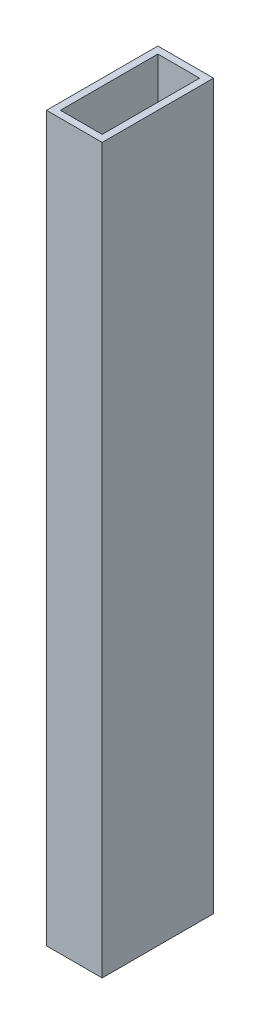
ISO-10303-21;
HEADER;
FILE_DESCRIPTION(('STEP AP214'),'2;1');
FILE_NAME('part.step','',(''),(''),'','','');
FILE_SCHEMA(('AUTOMOTIVE_DESIGN { 1 0 10303 214 1 1 1 1 }'));
ENDSEC;
DATA;
#1=APPLICATION_CONTEXT('core data for automotive mechanical design processes');
#2=APPLICATION_PROTOCOL_DEFINITION('international standard','automotive_design',2000,#1);
#3=PRODUCT_CONTEXT('',#1,'mechanical');
#4=PRODUCT('Part','Part','',(#3));
#5=PRODUCT_RELATED_PRODUCT_CATEGORY('part','',(#4));
#6=PRODUCT_DEFINITION_FORMATION('','',#4);
#7=PRODUCT_DEFINITION_CONTEXT('part definition',#1,'design');
#8=PRODUCT_DEFINITION('design','',#6,#7);
#9=PRODUCT_DEFINITION_SHAPE('','',#8);
#10=(LENGTH_UNIT() NAMED_UNIT(*) SI_UNIT(.MILLI.,.METRE.));
#11=(NAMED_UNIT(*) PLANE_ANGLE_UNIT() SI_UNIT($,.RADIAN.));
#12=(NAMED_UNIT(*) SI_UNIT($,.STERADIAN.) SOLID_ANGLE_UNIT());
#13=UNCERTAINTY_MEASURE_WITH_UNIT(LENGTH_MEASURE(1.E-05),#10,'distance_accuracy_value','');
#14=(GEOMETRIC_REPRESENTATION_CONTEXT(3) GLOBAL_UNCERTAINTY_ASSIGNED_CONTEXT((#13)) GLOBAL_UNIT_ASSIGNED_CONTEXT((#10,
#11,#12)) REPRESENTATION_CONTEXT('',''));
#15=CARTESIAN_POINT('',(0.,0.,0.));
#16=DIRECTION('',(0.,0.,1.));
#17=DIRECTION('',(1.,0.,0.));
#18=AXIS2_PLACEMENT_3D('',#15,#16,#17);
#19=CARTESIAN_POINT('',(0.,330.2,0.));
#20=DIRECTION('',(0.,-1.,0.));
#21=DIRECTION('',(0.,0.,-1.));
#22=AXIS2_PLACEMENT_3D('',#19,#20,#21);
#23=PLANE('',#22);
#24=DIRECTION('',(0.,0.,-1.));
#25=VECTOR('',#24,1.);
#26=CARTESIAN_POINT('',(12.7,330.2,25.4));
#27=LINE('',#26,#25);
#28=CARTESIAN_POINT('',(12.7,330.2,25.4));
#29=VERTEX_POINT('',#28);
#30=CARTESIAN_POINT('',(12.7,330.2,-25.4));
#31=VERTEX_POINT('',#30);
#32=EDGE_CURVE('E159',#29,#31,#27,.T.);
#33=ORIENTED_EDGE('',*,*,#32,.T.);
#34=DIRECTION('',(-1.,0.,0.));
#35=VECTOR('',#34,1.);
#36=CARTESIAN_POINT('',(-12.7,330.2,-25.4));
#37=LINE('',#36,#35);
#38=CARTESIAN_POINT('',(-12.7,330.2,-25.4));
#39=VERTEX_POINT('',#38);
#40=EDGE_CURVE('E163',#31,#39,#37,.T.);
#41=ORIENTED_EDGE('',*,*,#40,.T.);
#42=DIRECTION('',(0.,0.,1.));
#43=VECTOR('',#42,1.);
#44=CARTESIAN_POINT('',(-12.7,330.2,25.4));
#45=LINE('',#44,#43);
#46=CARTESIAN_POINT('',(-12.7,330.2,25.4));
#47=VERTEX_POINT('',#46);
#48=EDGE_CURVE('E167',#39,#47,#45,.T.);
#49=ORIENTED_EDGE('',*,*,#48,.T.);
#50=DIRECTION('',(1.,0.,0.));
#51=VECTOR('',#50,1.);
#52=CARTESIAN_POINT('',(-12.7,330.2,25.4));
#53=LINE('',#52,#51);
#54=EDGE_CURVE('E170',#47,#29,#53,.T.);
#55=ORIENTED_EDGE('',*,*,#54,.T.);
#56=EDGE_LOOP('',(#33,#41,#49,#55));
#57=FACE_BOUND('',#56,.T.);
#58=DIRECTION('',(0.,0.,1.));
#59=VECTOR('',#58,1.);
#60=CARTESIAN_POINT('',(-9.525,330.2,22.225));
#61=LINE('',#60,#59);
#62=CARTESIAN_POINT('',(-9.525,330.2,-22.225));
#63=VERTEX_POINT('',#62);
#64=CARTESIAN_POINT('',(-9.525,330.2,22.225));
#65=VERTEX_POINT('',#64);
#66=EDGE_CURVE('E111',#63,#65,#61,.T.);
#67=ORIENTED_EDGE('',*,*,#66,.F.);
#68=DIRECTION('',(-1.,0.,0.));
#69=VECTOR('',#68,1.);
#70=CARTESIAN_POINT('',(-9.525,330.2,-22.225));
#71=LINE('',#70,#69);
#72=CARTESIAN_POINT('',(9.525,330.2,-22.225));
#73=VERTEX_POINT('',#72);
#74=EDGE_CURVE('E137',#73,#63,#71,.T.);
#75=ORIENTED_EDGE('',*,*,#74,.F.);
#76=DIRECTION('',(0.,0.,-1.));
#77=VECTOR('',#76,1.);
#78=CARTESIAN_POINT('',(9.525,330.2,22.225));
#79=LINE('',#78,#77);
#80=CARTESIAN_POINT('',(9.525,330.2,22.225));
#81=VERTEX_POINT('',#80);
#82=EDGE_CURVE('E133',#81,#73,#79,.T.);
#83=ORIENTED_EDGE('',*,*,#82,.F.);
#84=DIRECTION('',(1.,0.,0.));
#85=VECTOR('',#84,1.);
#86=CARTESIAN_POINT('',(-9.525,330.2,22.225));
#87=LINE('',#86,#85);
#88=EDGE_CURVE('E120',#65,#81,#87,.T.);
#89=ORIENTED_EDGE('',*,*,#88,.F.);
#90=EDGE_LOOP('',(#67,#75,#83,#89));
#91=FACE_BOUND('',#90,.T.);
#92=ADVANCED_FACE('F45',(#57,#91),#23,.F.);
#93=CARTESIAN_POINT('',(0.,0.,0.));
#94=DIRECTION('',(0.,-1.,0.));
#95=DIRECTION('',(0.,0.,-1.));
#96=AXIS2_PLACEMENT_3D('',#93,#94,#95);
#97=PLANE('',#96);
#98=DIRECTION('',(0.,0.,-1.));
#99=VECTOR('',#98,1.);
#100=CARTESIAN_POINT('',(12.7,0.,25.4));
#101=LINE('',#100,#99);
#102=CARTESIAN_POINT('',(12.7,0.,25.4));
#103=VERTEX_POINT('',#102);
#104=CARTESIAN_POINT('',(12.7,0.,-25.4));
#105=VERTEX_POINT('',#104);
#106=EDGE_CURVE('E129',#103,#105,#101,.T.);
#107=ORIENTED_EDGE('',*,*,#106,.F.);
#108=DIRECTION('',(1.,0.,0.));
#109=VECTOR('',#108,1.);
#110=CARTESIAN_POINT('',(-12.7,0.,25.4));
#111=LINE('',#110,#109);
#112=CARTESIAN_POINT('',(-12.7,0.,25.4));
#113=VERTEX_POINT('',#112);
#114=EDGE_CURVE('E164',#113,#103,#111,.T.);
#115=ORIENTED_EDGE('',*,*,#114,.F.);
#116=DIRECTION('',(0.,0.,1.));
#117=VECTOR('',#116,1.);
#118=CARTESIAN_POINT('',(-12.7,0.,25.4));
#119=LINE('',#118,#117);
#120=CARTESIAN_POINT('',(-12.7,0.,-25.4));
#121=VERTEX_POINT('',#120);
#122=EDGE_CURVE('E180',#121,#113,#119,.T.);
#123=ORIENTED_EDGE('',*,*,#122,.F.);
#124=DIRECTION('',(-1.,0.,0.));
#125=VECTOR('',#124,1.);
#126=CARTESIAN_POINT('',(-12.7,0.,-25.4));
#127=LINE('',#126,#125);
#128=EDGE_CURVE('E177',#105,#121,#127,.T.);
#129=ORIENTED_EDGE('',*,*,#128,.F.);
#130=EDGE_LOOP('',(#107,#115,#123,#129));
#131=FACE_BOUND('',#130,.T.);
#132=DIRECTION('',(-1.,0.,0.));
#133=VECTOR('',#132,1.);
#134=CARTESIAN_POINT('',(-9.525,0.,-22.225));
#135=LINE('',#134,#133);
#136=CARTESIAN_POINT('',(9.525,0.,-22.225));
#137=VERTEX_POINT('',#136);
#138=CARTESIAN_POINT('',(-9.525,0.,-22.225));
#139=VERTEX_POINT('',#138);
#140=EDGE_CURVE('E121',#137,#139,#135,.T.);
#141=ORIENTED_EDGE('',*,*,#140,.T.);
#142=DIRECTION('',(0.,0.,1.));
#143=VECTOR('',#142,1.);
#144=CARTESIAN_POINT('',(-9.525,0.,22.225));
#145=LINE('',#144,#143);
#146=CARTESIAN_POINT('',(-9.525,0.,22.225));
#147=VERTEX_POINT('',#146);
#148=EDGE_CURVE('E69',#139,#147,#145,.T.);
#149=ORIENTED_EDGE('',*,*,#148,.T.);
#150=DIRECTION('',(1.,0.,0.));
#151=VECTOR('',#150,1.);
#152=CARTESIAN_POINT('',(-9.525,0.,22.225));
#153=LINE('',#152,#151);
#154=CARTESIAN_POINT('',(9.525,0.,22.225));
#155=VERTEX_POINT('',#154);
#156=EDGE_CURVE('E127',#147,#155,#153,.T.);
#157=ORIENTED_EDGE('',*,*,#156,.T.);
#158=DIRECTION('',(0.,0.,-1.));
#159=VECTOR('',#158,1.);
#160=CARTESIAN_POINT('',(9.525,0.,22.225));
#161=LINE('',#160,#159);
#162=EDGE_CURVE('E146',#155,#137,#161,.T.);
#163=ORIENTED_EDGE('',*,*,#162,.T.);
#164=EDGE_LOOP('',(#141,#149,#157,#163));
#165=FACE_BOUND('',#164,.T.);
#166=ADVANCED_FACE('F203',(#131,#165),#97,.T.);
#167=CARTESIAN_POINT('',(12.7,330.2,25.4));
#168=DIRECTION('',(-1.,0.,0.));
#169=DIRECTION('',(0.,0.,1.));
#170=AXIS2_PLACEMENT_3D('',#167,#168,#169);
#171=PLANE('',#170);
#172=ORIENTED_EDGE('',*,*,#106,.T.);
#173=DIRECTION('',(0.,-1.,0.));
#174=VECTOR('',#173,1.);
#175=CARTESIAN_POINT('',(12.7,330.2,-25.4));
#176=LINE('',#175,#174);
#177=EDGE_CURVE('E11',#31,#105,#176,.T.);
#178=ORIENTED_EDGE('',*,*,#177,.F.);
#179=ORIENTED_EDGE('',*,*,#32,.F.);
#180=DIRECTION('',(0.,-1.,0.));
#181=VECTOR('',#180,1.);
#182=CARTESIAN_POINT('',(12.7,330.2,25.4));
#183=LINE('',#182,#181);
#184=EDGE_CURVE('E173',#29,#103,#183,.T.);
#185=ORIENTED_EDGE('',*,*,#184,.T.);
#186=EDGE_LOOP('',(#172,#178,#179,#185));
#187=FACE_BOUND('',#186,.T.);
#188=ADVANCED_FACE('F47',(#187),#171,.F.);
#189=CARTESIAN_POINT('',(-12.7,330.2,-25.4));
#190=DIRECTION('',(0.,0.,1.));
#191=DIRECTION('',(1.,0.,0.));
#192=AXIS2_PLACEMENT_3D('',#189,#190,#191);
#193=PLANE('',#192);
#194=ORIENTED_EDGE('',*,*,#128,.T.);
#195=DIRECTION('',(0.,-1.,0.));
#196=VECTOR('',#195,1.);
#197=CARTESIAN_POINT('',(-12.7,330.2,-25.4));
#198=LINE('',#197,#196);
#199=EDGE_CURVE('E54',#39,#121,#198,.T.);
#200=ORIENTED_EDGE('',*,*,#199,.F.);
#201=ORIENTED_EDGE('',*,*,#40,.F.);
#202=ORIENTED_EDGE('',*,*,#177,.T.);
#203=EDGE_LOOP('',(#194,#200,#201,#202));
#204=FACE_BOUND('',#203,.T.);
#205=ADVANCED_FACE('F213',(#204),#193,.F.);
#206=CARTESIAN_POINT('',(-12.7,330.2,25.4));
#207=DIRECTION('',(1.,0.,0.));
#208=DIRECTION('',(0.,0.,-1.));
#209=AXIS2_PLACEMENT_3D('',#206,#207,#208);
#210=PLANE('',#209);
#211=ORIENTED_EDGE('',*,*,#122,.T.);
#212=DIRECTION('',(0.,-1.,0.));
#213=VECTOR('',#212,1.);
#214=CARTESIAN_POINT('',(-12.7,330.2,25.4));
#215=LINE('',#214,#213);
#216=EDGE_CURVE('E188',#47,#113,#215,.T.);
#217=ORIENTED_EDGE('',*,*,#216,.F.);
#218=ORIENTED_EDGE('',*,*,#48,.F.);
#219=ORIENTED_EDGE('',*,*,#199,.T.);
#220=EDGE_LOOP('',(#211,#217,#218,#219));
#221=FACE_BOUND('',#220,.T.);
#222=ADVANCED_FACE('F197',(#221),#210,.F.);
#223=CARTESIAN_POINT('',(-12.7,330.2,25.4));
#224=DIRECTION('',(0.,0.,-1.));
#225=DIRECTION('',(-1.,0.,0.));
#226=AXIS2_PLACEMENT_3D('',#223,#224,#225);
#227=PLANE('',#226);
#228=ORIENTED_EDGE('',*,*,#114,.T.);
#229=ORIENTED_EDGE('',*,*,#184,.F.);
#230=ORIENTED_EDGE('',*,*,#54,.F.);
#231=ORIENTED_EDGE('',*,*,#216,.T.);
#232=EDGE_LOOP('',(#228,#229,#230,#231));
#233=FACE_BOUND('',#232,.T.);
#234=ADVANCED_FACE('F207',(#233),#227,.F.);
#235=CARTESIAN_POINT('',(-9.525,330.2,22.225));
#236=DIRECTION('',(1.,0.,0.));
#237=DIRECTION('',(0.,0.,-1.));
#238=AXIS2_PLACEMENT_3D('',#235,#236,#237);
#239=PLANE('',#238);
#240=ORIENTED_EDGE('',*,*,#148,.F.);
#241=DIRECTION('',(0.,-1.,0.));
#242=VECTOR('',#241,1.);
#243=CARTESIAN_POINT('',(-9.525,330.2,-22.225));
#244=LINE('',#243,#242);
#245=EDGE_CURVE('E115',#63,#139,#244,.T.);
#246=ORIENTED_EDGE('',*,*,#245,.F.);
#247=ORIENTED_EDGE('',*,*,#66,.T.);
#248=DIRECTION('',(0.,-1.,0.));
#249=VECTOR('',#248,1.);
#250=CARTESIAN_POINT('',(-9.525,330.2,22.225));
#251=LINE('',#250,#249);
#252=EDGE_CURVE('E114',#65,#147,#251,.T.);
#253=ORIENTED_EDGE('',*,*,#252,.T.);
#254=EDGE_LOOP('',(#240,#246,#247,#253));
#255=FACE_BOUND('',#254,.T.);
#256=ADVANCED_FACE('F113',(#255),#239,.T.);
#257=CARTESIAN_POINT('',(-9.525,330.2,22.225));
#258=DIRECTION('',(0.,0.,-1.));
#259=DIRECTION('',(-1.,0.,0.));
#260=AXIS2_PLACEMENT_3D('',#257,#258,#259);
#261=PLANE('',#260);
#262=ORIENTED_EDGE('',*,*,#156,.F.);
#263=ORIENTED_EDGE('',*,*,#252,.F.);
#264=ORIENTED_EDGE('',*,*,#88,.T.);
#265=DIRECTION('',(0.,-1.,0.));
#266=VECTOR('',#265,1.);
#267=CARTESIAN_POINT('',(9.525,330.2,22.225));
#268=LINE('',#267,#266);
#269=EDGE_CURVE('E130',#81,#155,#268,.T.);
#270=ORIENTED_EDGE('',*,*,#269,.T.);
#271=EDGE_LOOP('',(#262,#263,#264,#270));
#272=FACE_BOUND('',#271,.T.);
#273=ADVANCED_FACE('F124',(#272),#261,.T.);
#274=CARTESIAN_POINT('',(9.525,330.2,22.225));
#275=DIRECTION('',(-1.,0.,0.));
#276=DIRECTION('',(0.,0.,1.));
#277=AXIS2_PLACEMENT_3D('',#274,#275,#276);
#278=PLANE('',#277);
#279=ORIENTED_EDGE('',*,*,#162,.F.);
#280=ORIENTED_EDGE('',*,*,#269,.F.);
#281=ORIENTED_EDGE('',*,*,#82,.T.);
#282=DIRECTION('',(0.,-1.,0.));
#283=VECTOR('',#282,1.);
#284=CARTESIAN_POINT('',(9.525,330.2,-22.225));
#285=LINE('',#284,#283);
#286=EDGE_CURVE('E61',#73,#137,#285,.T.);
#287=ORIENTED_EDGE('',*,*,#286,.T.);
#288=EDGE_LOOP('',(#279,#280,#281,#287));
#289=FACE_BOUND('',#288,.T.);
#290=ADVANCED_FACE('F236',(#289),#278,.T.);
#291=CARTESIAN_POINT('',(-9.525,330.2,-22.225));
#292=DIRECTION('',(0.,0.,1.));
#293=DIRECTION('',(1.,0.,0.));
#294=AXIS2_PLACEMENT_3D('',#291,#292,#293);
#295=PLANE('',#294);
#296=ORIENTED_EDGE('',*,*,#140,.F.);
#297=ORIENTED_EDGE('',*,*,#286,.F.);
#298=ORIENTED_EDGE('',*,*,#74,.T.);
#299=ORIENTED_EDGE('',*,*,#245,.T.);
#300=EDGE_LOOP('',(#296,#297,#298,#299));
#301=FACE_BOUND('',#300,.T.);
#302=ADVANCED_FACE('F240',(#301),#295,.T.);
#303=CLOSED_SHELL('',(#92,#166,#188,#205,#222,#234,#256,#273,#290,#302));
#304=MANIFOLD_SOLID_BREP('B2',#303);
#305=ADVANCED_BREP_SHAPE_REPRESENTATION('',(#18,#304),#14);
#306=SHAPE_DEFINITION_REPRESENTATION(#9,#305);
ENDSEC;
END-ISO-10303-21;
